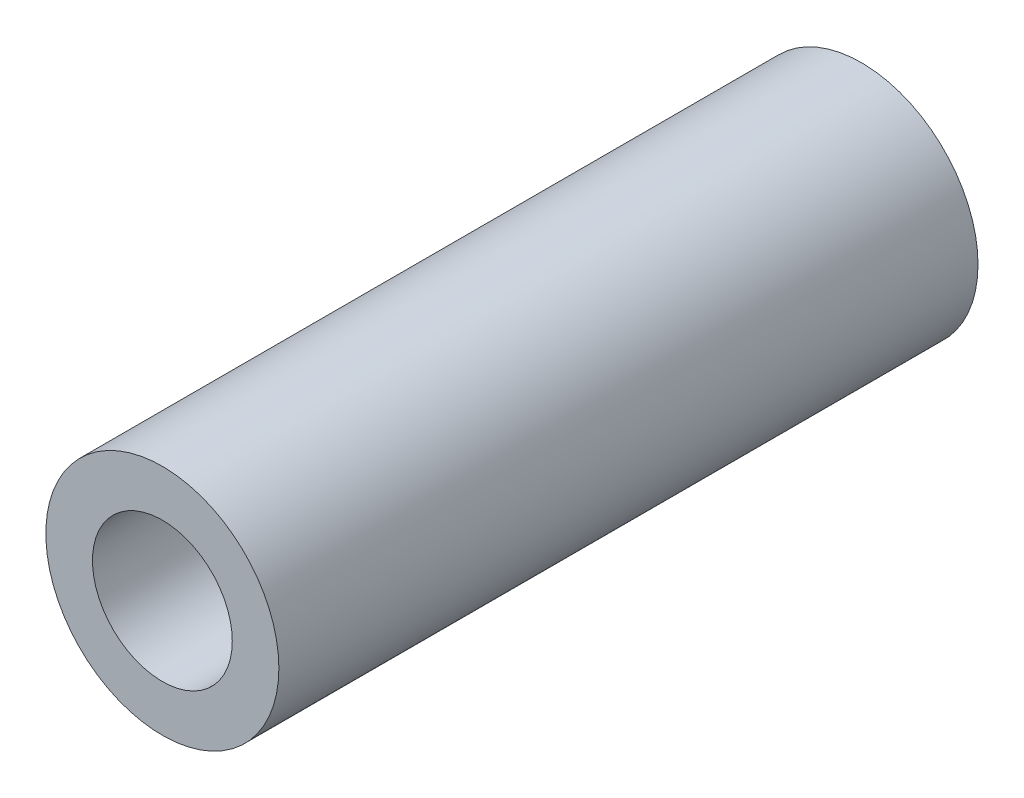
ISO-10303-21;
HEADER;
FILE_DESCRIPTION(('STEP AP214'),'2;1');
FILE_NAME('part.step','',(''),(''),'','','');
FILE_SCHEMA(('AUTOMOTIVE_DESIGN { 1 0 10303 214 1 1 1 1 }'));
ENDSEC;
DATA;
#1=APPLICATION_CONTEXT('core data for automotive mechanical design processes');
#2=APPLICATION_PROTOCOL_DEFINITION('international standard','automotive_design',2000,#1);
#3=PRODUCT_CONTEXT('',#1,'mechanical');
#4=PRODUCT('Part','Part','',(#3));
#5=PRODUCT_RELATED_PRODUCT_CATEGORY('part','',(#4));
#6=PRODUCT_DEFINITION_FORMATION('','',#4);
#7=PRODUCT_DEFINITION_CONTEXT('part definition',#1,'design');
#8=PRODUCT_DEFINITION('design','',#6,#7);
#9=PRODUCT_DEFINITION_SHAPE('','',#8);
#10=(LENGTH_UNIT() NAMED_UNIT(*) SI_UNIT(.MILLI.,.METRE.));
#11=(NAMED_UNIT(*) PLANE_ANGLE_UNIT() SI_UNIT($,.RADIAN.));
#12=(NAMED_UNIT(*) SI_UNIT($,.STERADIAN.) SOLID_ANGLE_UNIT());
#13=UNCERTAINTY_MEASURE_WITH_UNIT(LENGTH_MEASURE(1.E-05),#10,'distance_accuracy_value','');
#14=(GEOMETRIC_REPRESENTATION_CONTEXT(3) GLOBAL_UNCERTAINTY_ASSIGNED_CONTEXT((#13)) GLOBAL_UNIT_ASSIGNED_CONTEXT((#10,
#11,#12)) REPRESENTATION_CONTEXT('',''));
#15=CARTESIAN_POINT('',(0.,0.,0.));
#16=DIRECTION('',(0.,0.,1.));
#17=DIRECTION('',(1.,0.,0.));
#18=AXIS2_PLACEMENT_3D('',#15,#16,#17);
#19=CARTESIAN_POINT('',(0.,0.,15.));
#20=DIRECTION('',(0.,0.,1.));
#21=DIRECTION('',(1.,0.,0.));
#22=AXIS2_PLACEMENT_3D('',#19,#20,#21);
#23=PLANE('',#22);
#24=CARTESIAN_POINT('',(0.,0.,15.));
#25=DIRECTION('',(0.,0.,1.));
#26=DIRECTION('',(1.,0.,0.));
#27=AXIS2_PLACEMENT_3D('',#24,#25,#26);
#28=CIRCLE('',#27,2.5);
#29=CARTESIAN_POINT('',(2.5,0.,15.));
#30=VERTEX_POINT('',#29);
#31=EDGE_CURVE('E10',#30,#30,#28,.T.);
#32=ORIENTED_EDGE('',*,*,#31,.T.);
#33=EDGE_LOOP('',(#32));
#34=FACE_BOUND('',#33,.T.);
#35=CARTESIAN_POINT('',(0.,0.,15.));
#36=DIRECTION('',(0.,0.,1.));
#37=DIRECTION('',(1.,0.,0.));
#38=AXIS2_PLACEMENT_3D('',#35,#36,#37);
#39=CIRCLE('',#38,1.5);
#40=CARTESIAN_POINT('',(1.5,0.,15.));
#41=VERTEX_POINT('',#40);
#42=EDGE_CURVE('E42',#41,#41,#39,.T.);
#43=ORIENTED_EDGE('',*,*,#42,.F.);
#44=EDGE_LOOP('',(#43));
#45=FACE_BOUND('',#44,.T.);
#46=ADVANCED_FACE('F31',(#34,#45),#23,.T.);
#47=CARTESIAN_POINT('',(0.,0.,0.));
#48=DIRECTION('',(0.,0.,1.));
#49=DIRECTION('',(1.,0.,0.));
#50=AXIS2_PLACEMENT_3D('',#47,#48,#49);
#51=PLANE('',#50);
#52=CARTESIAN_POINT('',(0.,0.,0.));
#53=DIRECTION('',(0.,0.,1.));
#54=DIRECTION('',(1.,0.,0.));
#55=AXIS2_PLACEMENT_3D('',#52,#53,#54);
#56=CIRCLE('',#55,2.5);
#57=CARTESIAN_POINT('',(2.5,0.,0.));
#58=VERTEX_POINT('',#57);
#59=EDGE_CURVE('E35',#58,#58,#56,.T.);
#60=ORIENTED_EDGE('',*,*,#59,.F.);
#61=EDGE_LOOP('',(#60));
#62=FACE_BOUND('',#61,.T.);
#63=CARTESIAN_POINT('',(0.,0.,0.));
#64=DIRECTION('',(0.,0.,1.));
#65=DIRECTION('',(1.,0.,0.));
#66=AXIS2_PLACEMENT_3D('',#63,#64,#65);
#67=CIRCLE('',#66,1.5);
#68=CARTESIAN_POINT('',(1.5,0.,0.));
#69=VERTEX_POINT('',#68);
#70=EDGE_CURVE('E44',#69,#69,#67,.T.);
#71=ORIENTED_EDGE('',*,*,#70,.T.);
#72=EDGE_LOOP('',(#71));
#73=FACE_BOUND('',#72,.T.);
#74=ADVANCED_FACE('F54',(#62,#73),#51,.F.);
#75=CARTESIAN_POINT('',(0.,0.,15.));
#76=DIRECTION('',(0.,0.,-1.));
#77=DIRECTION('',(-1.,0.,0.));
#78=AXIS2_PLACEMENT_3D('',#75,#76,#77);
#79=CYLINDRICAL_SURFACE('',#78,2.5);
#80=ORIENTED_EDGE('',*,*,#31,.F.);
#81=EDGE_LOOP('',(#80));
#82=FACE_BOUND('',#81,.T.);
#83=ORIENTED_EDGE('',*,*,#59,.T.);
#84=EDGE_LOOP('',(#83));
#85=FACE_BOUND('',#84,.T.);
#86=ADVANCED_FACE('F33',(#82,#85),#79,.T.);
#87=CARTESIAN_POINT('',(0.,0.,15.));
#88=DIRECTION('',(0.,0.,-1.));
#89=DIRECTION('',(-1.,0.,0.));
#90=AXIS2_PLACEMENT_3D('',#87,#88,#89);
#91=CYLINDRICAL_SURFACE('',#90,1.5);
#92=ORIENTED_EDGE('',*,*,#42,.T.);
#93=EDGE_LOOP('',(#92));
#94=FACE_BOUND('',#93,.T.);
#95=ORIENTED_EDGE('',*,*,#70,.F.);
#96=EDGE_LOOP('',(#95));
#97=FACE_BOUND('',#96,.T.);
#98=ADVANCED_FACE('F50',(#94,#97),#91,.F.);
#99=CLOSED_SHELL('',(#46,#74,#86,#98));
#100=MANIFOLD_SOLID_BREP('B2',#99);
#101=ADVANCED_BREP_SHAPE_REPRESENTATION('',(#18,#100),#14);
#102=SHAPE_DEFINITION_REPRESENTATION(#9,#101);
ENDSEC;
END-ISO-10303-21;
